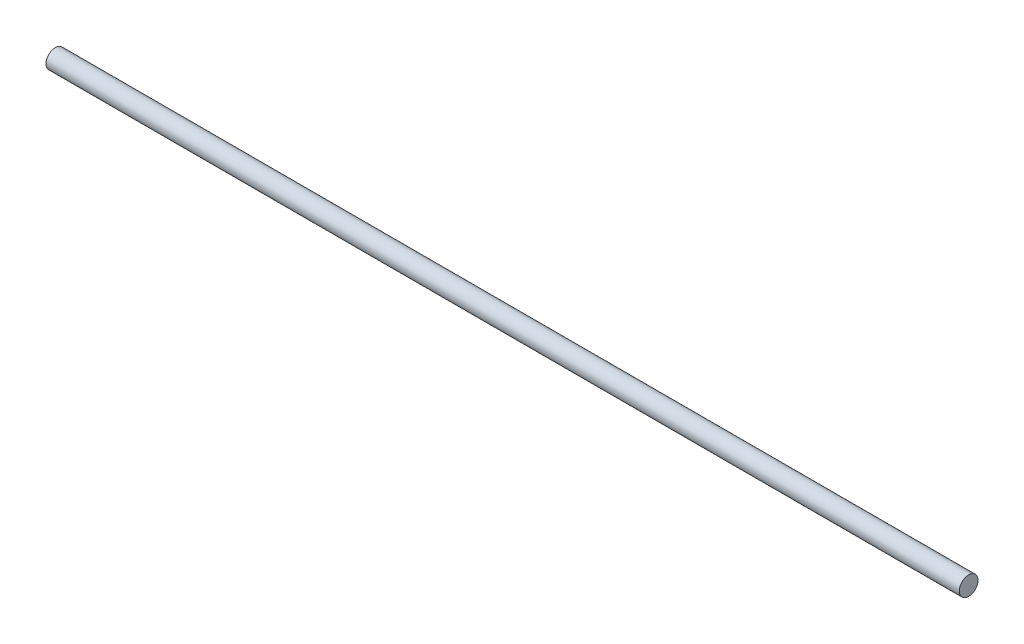
ISO-10303-21;
HEADER;
FILE_DESCRIPTION(('STEP AP214'),'2;1');
FILE_NAME('part.step','',(''),(''),'','','');
FILE_SCHEMA(('AUTOMOTIVE_DESIGN { 1 0 10303 214 1 1 1 1 }'));
ENDSEC;
DATA;
#1=APPLICATION_CONTEXT('core data for automotive mechanical design processes');
#2=APPLICATION_PROTOCOL_DEFINITION('international standard','automotive_design',2000,#1);
#3=PRODUCT_CONTEXT('',#1,'mechanical');
#4=PRODUCT('Part','Part','',(#3));
#5=PRODUCT_RELATED_PRODUCT_CATEGORY('part','',(#4));
#6=PRODUCT_DEFINITION_FORMATION('','',#4);
#7=PRODUCT_DEFINITION_CONTEXT('part definition',#1,'design');
#8=PRODUCT_DEFINITION('design','',#6,#7);
#9=PRODUCT_DEFINITION_SHAPE('','',#8);
#10=(LENGTH_UNIT() NAMED_UNIT(*) SI_UNIT(.MILLI.,.METRE.));
#11=(NAMED_UNIT(*) PLANE_ANGLE_UNIT() SI_UNIT($,.RADIAN.));
#12=(NAMED_UNIT(*) SI_UNIT($,.STERADIAN.) SOLID_ANGLE_UNIT());
#13=UNCERTAINTY_MEASURE_WITH_UNIT(LENGTH_MEASURE(1.E-05),#10,'distance_accuracy_value','');
#14=(GEOMETRIC_REPRESENTATION_CONTEXT(3) GLOBAL_UNCERTAINTY_ASSIGNED_CONTEXT((#13)) GLOBAL_UNIT_ASSIGNED_CONTEXT((#10,
#11,#12)) REPRESENTATION_CONTEXT('',''));
#15=CARTESIAN_POINT('',(0.,0.,0.));
#16=DIRECTION('',(0.,0.,1.));
#17=DIRECTION('',(1.,0.,0.));
#18=AXIS2_PLACEMENT_3D('',#15,#16,#17);
#19=CARTESIAN_POINT('',(390.,0.,0.));
#20=DIRECTION('',(-1.,0.,0.));
#21=DIRECTION('',(0.,0.,1.));
#22=AXIS2_PLACEMENT_3D('',#19,#20,#21);
#23=CYLINDRICAL_SURFACE('',#22,4.);
#24=CARTESIAN_POINT('',(390.,0.,0.));
#25=DIRECTION('',(1.,0.,0.));
#26=DIRECTION('',(0.,0.,-1.));
#27=AXIS2_PLACEMENT_3D('',#24,#25,#26);
#28=CIRCLE('',#27,4.);
#29=CARTESIAN_POINT('',(390.,0.,-4.));
#30=VERTEX_POINT('',#29);
#31=EDGE_CURVE('E10',#30,#30,#28,.T.);
#32=ORIENTED_EDGE('',*,*,#31,.F.);
#33=EDGE_LOOP('',(#32));
#34=FACE_BOUND('',#33,.T.);
#35=CARTESIAN_POINT('',(0.,0.,0.));
#36=DIRECTION('',(1.,0.,0.));
#37=DIRECTION('',(0.,0.,-1.));
#38=AXIS2_PLACEMENT_3D('',#35,#36,#37);
#39=CIRCLE('',#38,4.);
#40=CARTESIAN_POINT('',(0.,0.,-4.));
#41=VERTEX_POINT('',#40);
#42=EDGE_CURVE('E40',#41,#41,#39,.T.);
#43=ORIENTED_EDGE('',*,*,#42,.T.);
#44=EDGE_LOOP('',(#43));
#45=FACE_BOUND('',#44,.T.);
#46=ADVANCED_FACE('F37',(#34,#45),#23,.T.);
#47=CARTESIAN_POINT('',(390.,0.,0.));
#48=DIRECTION('',(1.,0.,0.));
#49=DIRECTION('',(0.,0.,-1.));
#50=AXIS2_PLACEMENT_3D('',#47,#48,#49);
#51=PLANE('',#50);
#52=ORIENTED_EDGE('',*,*,#31,.T.);
#53=EDGE_LOOP('',(#52));
#54=FACE_BOUND('',#53,.T.);
#55=ADVANCED_FACE('F54',(#54),#51,.T.);
#56=CARTESIAN_POINT('',(0.,0.,0.));
#57=DIRECTION('',(1.,0.,0.));
#58=DIRECTION('',(0.,0.,-1.));
#59=AXIS2_PLACEMENT_3D('',#56,#57,#58);
#60=PLANE('',#59);
#61=ORIENTED_EDGE('',*,*,#42,.F.);
#62=EDGE_LOOP('',(#61));
#63=FACE_BOUND('',#62,.T.);
#64=ADVANCED_FACE('F52',(#63),#60,.F.);
#65=CLOSED_SHELL('',(#46,#55,#64));
#66=MANIFOLD_SOLID_BREP('B2',#65);
#67=ADVANCED_BREP_SHAPE_REPRESENTATION('',(#18,#66),#14);
#68=SHAPE_DEFINITION_REPRESENTATION(#9,#67);
ENDSEC;
END-ISO-10303-21;
